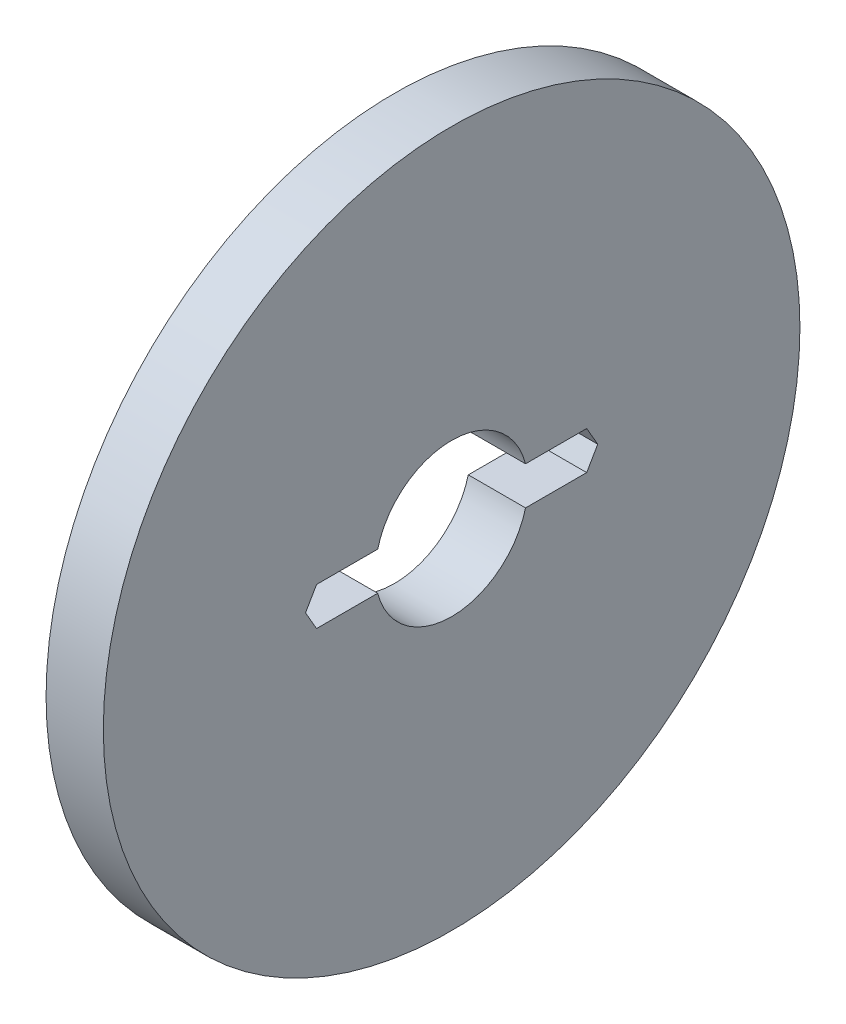
ISO-10303-21;
HEADER;
FILE_DESCRIPTION(('STEP AP214'),'2;1');
FILE_NAME('part.step','',(''),(''),'','','');
FILE_SCHEMA(('AUTOMOTIVE_DESIGN { 1 0 10303 214 1 1 1 1 }'));
ENDSEC;
DATA;
#1=APPLICATION_CONTEXT('core data for automotive mechanical design processes');
#2=APPLICATION_PROTOCOL_DEFINITION('international standard','automotive_design',2000,#1);
#3=PRODUCT_CONTEXT('',#1,'mechanical');
#4=PRODUCT('Part','Part','',(#3));
#5=PRODUCT_RELATED_PRODUCT_CATEGORY('part','',(#4));
#6=PRODUCT_DEFINITION_FORMATION('','',#4);
#7=PRODUCT_DEFINITION_CONTEXT('part definition',#1,'design');
#8=PRODUCT_DEFINITION('design','',#6,#7);
#9=PRODUCT_DEFINITION_SHAPE('','',#8);
#10=(LENGTH_UNIT() NAMED_UNIT(*) SI_UNIT(.MILLI.,.METRE.));
#11=(NAMED_UNIT(*) PLANE_ANGLE_UNIT() SI_UNIT($,.RADIAN.));
#12=(NAMED_UNIT(*) SI_UNIT($,.STERADIAN.) SOLID_ANGLE_UNIT());
#13=UNCERTAINTY_MEASURE_WITH_UNIT(LENGTH_MEASURE(1.E-05),#10,'distance_accuracy_value','');
#14=(GEOMETRIC_REPRESENTATION_CONTEXT(3) GLOBAL_UNCERTAINTY_ASSIGNED_CONTEXT((#13)) GLOBAL_UNIT_ASSIGNED_CONTEXT((#10,
#11,#12)) REPRESENTATION_CONTEXT('',''));
#15=CARTESIAN_POINT('',(0.,0.,0.));
#16=DIRECTION('',(0.,0.,1.));
#17=DIRECTION('',(1.,0.,0.));
#18=AXIS2_PLACEMENT_3D('',#15,#16,#17);
#19=CARTESIAN_POINT('',(3.,0.,0.));
#20=DIRECTION('',(1.,0.,0.));
#21=DIRECTION('',(0.,0.,-1.));
#22=AXIS2_PLACEMENT_3D('',#19,#20,#21);
#23=PLANE('',#22);
#24=CARTESIAN_POINT('',(3.,0.,0.));
#25=DIRECTION('',(1.,0.,0.));
#26=DIRECTION('',(0.,0.,-1.));
#27=AXIS2_PLACEMENT_3D('',#24,#25,#26);
#28=CIRCLE('',#27,18.25);
#29=CARTESIAN_POINT('',(3.,0.,-18.25));
#30=VERTEX_POINT('',#29);
#31=EDGE_CURVE('E11',#30,#30,#28,.T.);
#32=ORIENTED_EDGE('',*,*,#31,.T.);
#33=EDGE_LOOP('',(#32));
#34=FACE_BOUND('',#33,.T.);
#35=DIRECTION('',(0.,0.,1.));
#36=VECTOR('',#35,1.);
#37=CARTESIAN_POINT('',(3.,1.,3.87298334620742));
#38=LINE('',#37,#36);
#39=CARTESIAN_POINT('',(3.,1.,3.87298334620742));
#40=VERTEX_POINT('',#39);
#41=CARTESIAN_POINT('',(3.,1.,7.07735026918962));
#42=VERTEX_POINT('',#41);
#43=EDGE_CURVE('E119',#40,#42,#38,.T.);
#44=ORIENTED_EDGE('',*,*,#43,.F.);
#45=CARTESIAN_POINT('',(3.,0.,0.));
#46=DIRECTION('',(1.,0.,0.));
#47=DIRECTION('',(0.,0.,-1.));
#48=AXIS2_PLACEMENT_3D('',#45,#46,#47);
#49=CIRCLE('',#48,4.);
#50=CARTESIAN_POINT('',(3.,1.,-3.87298334620742));
#51=VERTEX_POINT('',#50);
#52=EDGE_CURVE('E111',#51,#40,#49,.T.);
#53=ORIENTED_EDGE('',*,*,#52,.F.);
#54=DIRECTION('',(0.,0.,1.));
#55=VECTOR('',#54,1.);
#56=CARTESIAN_POINT('',(3.,1.,-7.07735026918962));
#57=LINE('',#56,#55);
#58=CARTESIAN_POINT('',(3.,0.999999999999999,-7.07735026918962));
#59=VERTEX_POINT('',#58);
#60=EDGE_CURVE('E147',#59,#51,#57,.T.);
#61=ORIENTED_EDGE('',*,*,#60,.F.);
#62=DIRECTION('',(0.,0.866025403784438,0.5));
#63=VECTOR('',#62,1.);
#64=CARTESIAN_POINT('',(3.,0.,-7.65470053837925));
#65=LINE('',#64,#63);
#66=CARTESIAN_POINT('',(3.,0.,-7.65470053837925));
#67=VERTEX_POINT('',#66);
#68=EDGE_CURVE('E145',#67,#59,#65,.T.);
#69=ORIENTED_EDGE('',*,*,#68,.F.);
#70=DIRECTION('',(0.,0.866025403784439,-0.5));
#71=VECTOR('',#70,1.);
#72=CARTESIAN_POINT('',(3.,-1.,-7.07735026918963));
#73=LINE('',#72,#71);
#74=CARTESIAN_POINT('',(3.,-1.,-7.07735026918963));
#75=VERTEX_POINT('',#74);
#76=EDGE_CURVE('E143',#75,#67,#73,.T.);
#77=ORIENTED_EDGE('',*,*,#76,.F.);
#78=DIRECTION('',(0.,0.,-1.));
#79=VECTOR('',#78,1.);
#80=CARTESIAN_POINT('',(3.,-1.,-5.92264973081037));
#81=LINE('',#80,#79);
#82=CARTESIAN_POINT('',(3.,-1.,-3.87298334620742));
#83=VERTEX_POINT('',#82);
#84=EDGE_CURVE('E141',#83,#75,#81,.T.);
#85=ORIENTED_EDGE('',*,*,#84,.F.);
#86=CARTESIAN_POINT('',(3.,0.,0.));
#87=DIRECTION('',(1.,0.,0.));
#88=DIRECTION('',(0.,0.,-1.));
#89=AXIS2_PLACEMENT_3D('',#86,#87,#88);
#90=CIRCLE('',#89,4.);
#91=CARTESIAN_POINT('',(3.,-1.,3.87298334620742));
#92=VERTEX_POINT('',#91);
#93=EDGE_CURVE('E139',#92,#83,#90,.T.);
#94=ORIENTED_EDGE('',*,*,#93,.F.);
#95=DIRECTION('',(0.,0.,-1.));
#96=VECTOR('',#95,1.);
#97=CARTESIAN_POINT('',(3.,-0.999999999999999,7.07735026918963));
#98=LINE('',#97,#96);
#99=CARTESIAN_POINT('',(3.,-0.999999999999999,7.07735026918963));
#100=VERTEX_POINT('',#99);
#101=EDGE_CURVE('E137',#100,#92,#98,.T.);
#102=ORIENTED_EDGE('',*,*,#101,.F.);
#103=DIRECTION('',(0.,-0.86602540378444,-0.499999999999998));
#104=VECTOR('',#103,1.);
#105=CARTESIAN_POINT('',(3.,0.,7.65470053837925));
#106=LINE('',#105,#104);
#107=CARTESIAN_POINT('',(3.,0.,7.65470053837925));
#108=VERTEX_POINT('',#107);
#109=EDGE_CURVE('E133',#108,#100,#106,.T.);
#110=ORIENTED_EDGE('',*,*,#109,.F.);
#111=DIRECTION('',(0.,-0.866025403784438,0.500000000000002));
#112=VECTOR('',#111,1.);
#113=CARTESIAN_POINT('',(3.,1.,7.07735026918962));
#114=LINE('',#113,#112);
#115=EDGE_CURVE('E131',#42,#108,#114,.T.);
#116=ORIENTED_EDGE('',*,*,#115,.F.);
#117=EDGE_LOOP('',(#44,#53,#61,#69,#77,#85,#94,#102,#110,#116));
#118=FACE_BOUND('',#117,.T.);
#119=ADVANCED_FACE('F34',(#34,#118),#23,.T.);
#120=CARTESIAN_POINT('',(0.,0.,0.));
#121=DIRECTION('',(1.,0.,0.));
#122=DIRECTION('',(0.,0.,-1.));
#123=AXIS2_PLACEMENT_3D('',#120,#121,#122);
#124=PLANE('',#123);
#125=CARTESIAN_POINT('',(0.,0.,0.));
#126=DIRECTION('',(1.,0.,0.));
#127=DIRECTION('',(0.,0.,-1.));
#128=AXIS2_PLACEMENT_3D('',#125,#126,#127);
#129=CIRCLE('',#128,18.25);
#130=CARTESIAN_POINT('',(0.,0.,-18.25));
#131=VERTEX_POINT('',#130);
#132=EDGE_CURVE('E38',#131,#131,#129,.T.);
#133=ORIENTED_EDGE('',*,*,#132,.F.);
#134=EDGE_LOOP('',(#133));
#135=FACE_BOUND('',#134,.T.);
#136=CARTESIAN_POINT('',(0.,0.,0.));
#137=DIRECTION('',(1.,0.,0.));
#138=DIRECTION('',(0.,0.,-1.));
#139=AXIS2_PLACEMENT_3D('',#136,#137,#138);
#140=CIRCLE('',#139,4.);
#141=CARTESIAN_POINT('',(0.,1.,-3.87298334620742));
#142=VERTEX_POINT('',#141);
#143=CARTESIAN_POINT('',(0.,1.,3.87298334620742));
#144=VERTEX_POINT('',#143);
#145=EDGE_CURVE('E57',#142,#144,#140,.T.);
#146=ORIENTED_EDGE('',*,*,#145,.T.);
#147=DIRECTION('',(0.,0.,1.));
#148=VECTOR('',#147,1.);
#149=CARTESIAN_POINT('',(0.,1.,5.92264973081037));
#150=LINE('',#149,#148);
#151=CARTESIAN_POINT('',(0.,1.,7.07735026918962));
#152=VERTEX_POINT('',#151);
#153=EDGE_CURVE('E126',#144,#152,#150,.T.);
#154=ORIENTED_EDGE('',*,*,#153,.T.);
#155=DIRECTION('',(0.,-0.866025403784438,0.500000000000002));
#156=VECTOR('',#155,1.);
#157=CARTESIAN_POINT('',(0.,1.,7.07735026918962));
#158=LINE('',#157,#156);
#159=CARTESIAN_POINT('',(0.,0.,7.65470053837925));
#160=VERTEX_POINT('',#159);
#161=EDGE_CURVE('E151',#152,#160,#158,.T.);
#162=ORIENTED_EDGE('',*,*,#161,.T.);
#163=DIRECTION('',(0.,-0.86602540378444,-0.499999999999998));
#164=VECTOR('',#163,1.);
#165=CARTESIAN_POINT('',(0.,0.,7.65470053837925));
#166=LINE('',#165,#164);
#167=CARTESIAN_POINT('',(0.,-0.999999999999999,7.07735026918963));
#168=VERTEX_POINT('',#167);
#169=EDGE_CURVE('E154',#160,#168,#166,.T.);
#170=ORIENTED_EDGE('',*,*,#169,.T.);
#171=DIRECTION('',(0.,0.,-1.));
#172=VECTOR('',#171,1.);
#173=CARTESIAN_POINT('',(0.,-1.,3.87298334620742));
#174=LINE('',#173,#172);
#175=CARTESIAN_POINT('',(0.,-1.,3.87298334620742));
#176=VERTEX_POINT('',#175);
#177=EDGE_CURVE('E157',#168,#176,#174,.T.);
#178=ORIENTED_EDGE('',*,*,#177,.T.);
#179=CARTESIAN_POINT('',(0.,0.,0.));
#180=DIRECTION('',(1.,0.,0.));
#181=DIRECTION('',(0.,0.,-1.));
#182=AXIS2_PLACEMENT_3D('',#179,#180,#181);
#183=CIRCLE('',#182,4.);
#184=CARTESIAN_POINT('',(0.,-1.,-3.87298334620742));
#185=VERTEX_POINT('',#184);
#186=EDGE_CURVE('E160',#176,#185,#183,.T.);
#187=ORIENTED_EDGE('',*,*,#186,.T.);
#188=DIRECTION('',(0.,0.,-1.));
#189=VECTOR('',#188,1.);
#190=CARTESIAN_POINT('',(0.,-1.,-6.5));
#191=LINE('',#190,#189);
#192=CARTESIAN_POINT('',(0.,-1.,-7.07735026918963));
#193=VERTEX_POINT('',#192);
#194=EDGE_CURVE('E163',#185,#193,#191,.T.);
#195=ORIENTED_EDGE('',*,*,#194,.T.);
#196=DIRECTION('',(0.,0.866025403784439,-0.5));
#197=VECTOR('',#196,1.);
#198=CARTESIAN_POINT('',(0.,-1.,-7.07735026918963));
#199=LINE('',#198,#197);
#200=CARTESIAN_POINT('',(0.,0.,-7.65470053837925));
#201=VERTEX_POINT('',#200);
#202=EDGE_CURVE('E166',#193,#201,#199,.T.);
#203=ORIENTED_EDGE('',*,*,#202,.T.);
#204=DIRECTION('',(0.,0.866025403784438,0.5));
#205=VECTOR('',#204,1.);
#206=CARTESIAN_POINT('',(0.,0.,-7.65470053837925));
#207=LINE('',#206,#205);
#208=CARTESIAN_POINT('',(0.,1.,-7.07735026918962));
#209=VERTEX_POINT('',#208);
#210=EDGE_CURVE('E169',#201,#209,#207,.T.);
#211=ORIENTED_EDGE('',*,*,#210,.T.);
#212=DIRECTION('',(0.,0.,1.));
#213=VECTOR('',#212,1.);
#214=CARTESIAN_POINT('',(0.,1.,-5.92264973081037));
#215=LINE('',#214,#213);
#216=EDGE_CURVE('E120',#209,#142,#215,.T.);
#217=ORIENTED_EDGE('',*,*,#216,.T.);
#218=EDGE_LOOP('',(#146,#154,#162,#170,#178,#187,#195,#203,#211,#217));
#219=FACE_BOUND('',#218,.T.);
#220=ADVANCED_FACE('F196',(#135,#219),#124,.F.);
#221=CARTESIAN_POINT('',(3.,0.,0.));
#222=DIRECTION('',(-1.,0.,0.));
#223=DIRECTION('',(0.,0.,1.));
#224=AXIS2_PLACEMENT_3D('',#221,#222,#223);
#225=CYLINDRICAL_SURFACE('',#224,18.25);
#226=ORIENTED_EDGE('',*,*,#31,.F.);
#227=EDGE_LOOP('',(#226));
#228=FACE_BOUND('',#227,.T.);
#229=ORIENTED_EDGE('',*,*,#132,.T.);
#230=EDGE_LOOP('',(#229));
#231=FACE_BOUND('',#230,.T.);
#232=ADVANCED_FACE('F36',(#228,#231),#225,.T.);
#233=CARTESIAN_POINT('',(3.,0.,0.));
#234=DIRECTION('',(-1.,0.,0.));
#235=DIRECTION('',(0.,0.,1.));
#236=AXIS2_PLACEMENT_3D('',#233,#234,#235);
#237=CYLINDRICAL_SURFACE('',#236,4.);
#238=ORIENTED_EDGE('',*,*,#145,.F.);
#239=DIRECTION('',(-1.,0.,0.));
#240=VECTOR('',#239,1.);
#241=CARTESIAN_POINT('',(3.,1.,-3.87298334620742));
#242=LINE('',#241,#240);
#243=EDGE_CURVE('E115',#51,#142,#242,.T.);
#244=ORIENTED_EDGE('',*,*,#243,.F.);
#245=ORIENTED_EDGE('',*,*,#52,.T.);
#246=DIRECTION('',(-1.,0.,0.));
#247=VECTOR('',#246,1.);
#248=CARTESIAN_POINT('',(3.,1.,3.87298334620742));
#249=LINE('',#248,#247);
#250=EDGE_CURVE('E114',#40,#144,#249,.T.);
#251=ORIENTED_EDGE('',*,*,#250,.T.);
#252=EDGE_LOOP('',(#238,#244,#245,#251));
#253=FACE_BOUND('',#252,.T.);
#254=ADVANCED_FACE('F113',(#253),#237,.F.);
#255=CARTESIAN_POINT('',(3.,1.,5.92264973081037));
#256=DIRECTION('',(0.,-1.,0.));
#257=DIRECTION('',(0.,0.,-1.));
#258=AXIS2_PLACEMENT_3D('',#255,#256,#257);
#259=PLANE('',#258);
#260=ORIENTED_EDGE('',*,*,#153,.F.);
#261=ORIENTED_EDGE('',*,*,#250,.F.);
#262=ORIENTED_EDGE('',*,*,#43,.T.);
#263=DIRECTION('',(-1.,0.,0.));
#264=VECTOR('',#263,1.);
#265=CARTESIAN_POINT('',(3.,1.,7.07735026918962));
#266=LINE('',#265,#264);
#267=EDGE_CURVE('E127',#42,#152,#266,.T.);
#268=ORIENTED_EDGE('',*,*,#267,.T.);
#269=EDGE_LOOP('',(#260,#261,#262,#268));
#270=FACE_BOUND('',#269,.T.);
#271=ADVANCED_FACE('F123',(#270),#259,.T.);
#272=CARTESIAN_POINT('',(3.,1.,7.07735026918962));
#273=DIRECTION('',(0.,-0.500000000000002,-0.866025403784438));
#274=DIRECTION('',(0.,0.866025403784438,-0.500000000000002));
#275=AXIS2_PLACEMENT_3D('',#272,#273,#274);
#276=PLANE('',#275);
#277=ORIENTED_EDGE('',*,*,#161,.F.);
#278=ORIENTED_EDGE('',*,*,#267,.F.);
#279=ORIENTED_EDGE('',*,*,#115,.T.);
#280=DIRECTION('',(-1.,0.,0.));
#281=VECTOR('',#280,1.);
#282=CARTESIAN_POINT('',(3.,0.,7.65470053837925));
#283=LINE('',#282,#281);
#284=EDGE_CURVE('E188',#108,#160,#283,.T.);
#285=ORIENTED_EDGE('',*,*,#284,.T.);
#286=EDGE_LOOP('',(#277,#278,#279,#285));
#287=FACE_BOUND('',#286,.T.);
#288=ADVANCED_FACE('F192',(#287),#276,.T.);
#289=CARTESIAN_POINT('',(3.,0.,7.65470053837925));
#290=DIRECTION('',(0.,0.499999999999998,-0.86602540378444));
#291=DIRECTION('',(0.,0.86602540378444,0.499999999999998));
#292=AXIS2_PLACEMENT_3D('',#289,#290,#291);
#293=PLANE('',#292);
#294=ORIENTED_EDGE('',*,*,#169,.F.);
#295=ORIENTED_EDGE('',*,*,#284,.F.);
#296=ORIENTED_EDGE('',*,*,#109,.T.);
#297=DIRECTION('',(-1.,0.,0.));
#298=VECTOR('',#297,1.);
#299=CARTESIAN_POINT('',(3.,-0.999999999999999,7.07735026918963));
#300=LINE('',#299,#298);
#301=EDGE_CURVE('E185',#100,#168,#300,.T.);
#302=ORIENTED_EDGE('',*,*,#301,.T.);
#303=EDGE_LOOP('',(#294,#295,#296,#302));
#304=FACE_BOUND('',#303,.T.);
#305=ADVANCED_FACE('F222',(#304),#293,.T.);
#306=CARTESIAN_POINT('',(3.,-1.,3.87298334620742));
#307=DIRECTION('',(0.,1.,0.));
#308=DIRECTION('',(0.,0.,1.));
#309=AXIS2_PLACEMENT_3D('',#306,#307,#308);
#310=PLANE('',#309);
#311=ORIENTED_EDGE('',*,*,#177,.F.);
#312=ORIENTED_EDGE('',*,*,#301,.F.);
#313=ORIENTED_EDGE('',*,*,#101,.T.);
#314=DIRECTION('',(-1.,0.,0.));
#315=VECTOR('',#314,1.);
#316=CARTESIAN_POINT('',(3.,-1.,3.87298334620742));
#317=LINE('',#316,#315);
#318=EDGE_CURVE('E183',#92,#176,#317,.T.);
#319=ORIENTED_EDGE('',*,*,#318,.T.);
#320=EDGE_LOOP('',(#311,#312,#313,#319));
#321=FACE_BOUND('',#320,.T.);
#322=ADVANCED_FACE('F219',(#321),#310,.T.);
#323=CARTESIAN_POINT('',(3.,0.,0.));
#324=DIRECTION('',(-1.,0.,0.));
#325=DIRECTION('',(0.,0.,1.));
#326=AXIS2_PLACEMENT_3D('',#323,#324,#325);
#327=CYLINDRICAL_SURFACE('',#326,4.);
#328=ORIENTED_EDGE('',*,*,#186,.F.);
#329=ORIENTED_EDGE('',*,*,#318,.F.);
#330=ORIENTED_EDGE('',*,*,#93,.T.);
#331=DIRECTION('',(-1.,0.,0.));
#332=VECTOR('',#331,1.);
#333=CARTESIAN_POINT('',(3.,-1.,-3.87298334620742));
#334=LINE('',#333,#332);
#335=EDGE_CURVE('E180',#83,#185,#334,.T.);
#336=ORIENTED_EDGE('',*,*,#335,.T.);
#337=EDGE_LOOP('',(#328,#329,#330,#336));
#338=FACE_BOUND('',#337,.T.);
#339=ADVANCED_FACE('F215',(#338),#327,.F.);
#340=CARTESIAN_POINT('',(3.,-1.,-6.5));
#341=DIRECTION('',(0.,1.,0.));
#342=DIRECTION('',(0.,0.,1.));
#343=AXIS2_PLACEMENT_3D('',#340,#341,#342);
#344=PLANE('',#343);
#345=ORIENTED_EDGE('',*,*,#194,.F.);
#346=ORIENTED_EDGE('',*,*,#335,.F.);
#347=ORIENTED_EDGE('',*,*,#84,.T.);
#348=DIRECTION('',(-1.,0.,0.));
#349=VECTOR('',#348,1.);
#350=CARTESIAN_POINT('',(3.,-1.,-7.07735026918963));
#351=LINE('',#350,#349);
#352=EDGE_CURVE('E178',#75,#193,#351,.T.);
#353=ORIENTED_EDGE('',*,*,#352,.T.);
#354=EDGE_LOOP('',(#345,#346,#347,#353));
#355=FACE_BOUND('',#354,.T.);
#356=ADVANCED_FACE('F211',(#355),#344,.T.);
#357=CARTESIAN_POINT('',(3.,-1.,-7.07735026918963));
#358=DIRECTION('',(0.,0.5,0.866025403784439));
#359=DIRECTION('',(0.,-0.866025403784439,0.5));
#360=AXIS2_PLACEMENT_3D('',#357,#358,#359);
#361=PLANE('',#360);
#362=ORIENTED_EDGE('',*,*,#202,.F.);
#363=ORIENTED_EDGE('',*,*,#352,.F.);
#364=ORIENTED_EDGE('',*,*,#76,.T.);
#365=DIRECTION('',(-1.,0.,0.));
#366=VECTOR('',#365,1.);
#367=CARTESIAN_POINT('',(3.,0.,-7.65470053837925));
#368=LINE('',#367,#366);
#369=EDGE_CURVE('E176',#67,#201,#368,.T.);
#370=ORIENTED_EDGE('',*,*,#369,.T.);
#371=EDGE_LOOP('',(#362,#363,#364,#370));
#372=FACE_BOUND('',#371,.T.);
#373=ADVANCED_FACE('F209',(#372),#361,.T.);
#374=CARTESIAN_POINT('',(3.,0.,-7.65470053837925));
#375=DIRECTION('',(0.,-0.5,0.866025403784439));
#376=DIRECTION('',(0.,-0.866025403784439,-0.5));
#377=AXIS2_PLACEMENT_3D('',#374,#375,#376);
#378=PLANE('',#377);
#379=ORIENTED_EDGE('',*,*,#210,.F.);
#380=ORIENTED_EDGE('',*,*,#369,.F.);
#381=ORIENTED_EDGE('',*,*,#68,.T.);
#382=DIRECTION('',(-1.,0.,0.));
#383=VECTOR('',#382,1.);
#384=CARTESIAN_POINT('',(3.,1.,-7.07735026918962));
#385=LINE('',#384,#383);
#386=EDGE_CURVE('E49',#59,#209,#385,.T.);
#387=ORIENTED_EDGE('',*,*,#386,.T.);
#388=EDGE_LOOP('',(#379,#380,#381,#387));
#389=FACE_BOUND('',#388,.T.);
#390=ADVANCED_FACE('F200',(#389),#378,.T.);
#391=CARTESIAN_POINT('',(3.,1.,-5.92264973081037));
#392=DIRECTION('',(0.,-1.,0.));
#393=DIRECTION('',(0.,0.,-1.));
#394=AXIS2_PLACEMENT_3D('',#391,#392,#393);
#395=PLANE('',#394);
#396=ORIENTED_EDGE('',*,*,#216,.F.);
#397=ORIENTED_EDGE('',*,*,#386,.F.);
#398=ORIENTED_EDGE('',*,*,#60,.T.);
#399=ORIENTED_EDGE('',*,*,#243,.T.);
#400=EDGE_LOOP('',(#396,#397,#398,#399));
#401=FACE_BOUND('',#400,.T.);
#402=ADVANCED_FACE('F198',(#401),#395,.T.);
#403=CLOSED_SHELL('',(#119,#220,#232,#254,#271,#288,#305,#322,#339,#356,#373,#390,#402));
#404=MANIFOLD_SOLID_BREP('B2',#403);
#405=ADVANCED_BREP_SHAPE_REPRESENTATION('',(#18,#404),#14);
#406=SHAPE_DEFINITION_REPRESENTATION(#9,#405);
ENDSEC;
END-ISO-10303-21;
